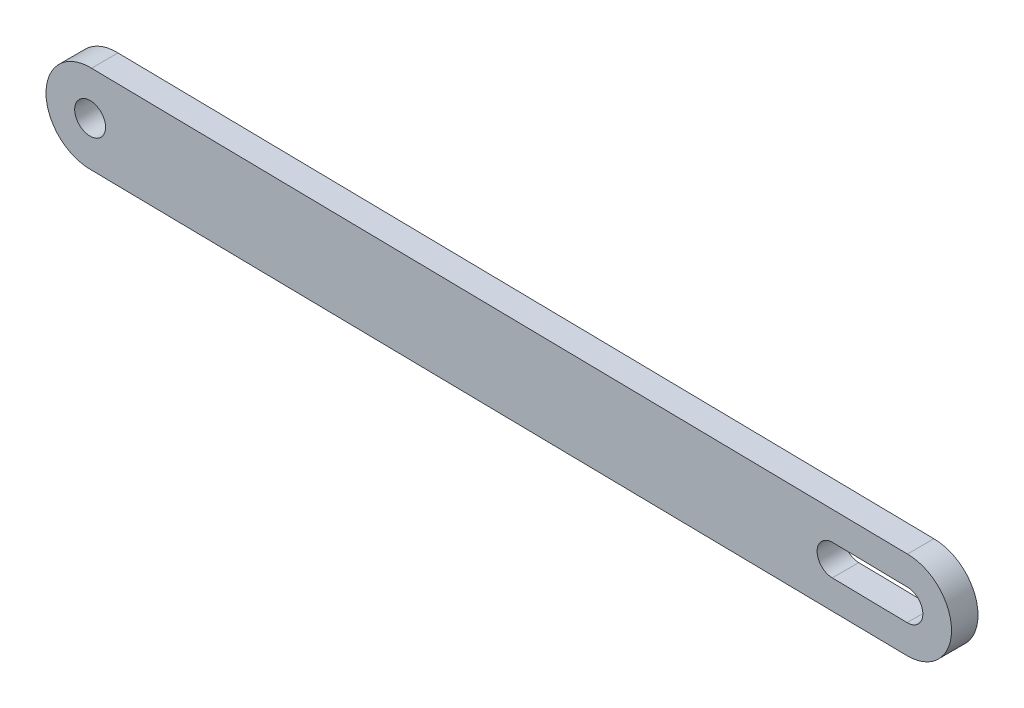
ISO-10303-21;
HEADER;
FILE_DESCRIPTION(('STEP AP214'),'2;1');
FILE_NAME('part.step','',(''),(''),'','','');
FILE_SCHEMA(('AUTOMOTIVE_DESIGN { 1 0 10303 214 1 1 1 1 }'));
ENDSEC;
DATA;
#1=APPLICATION_CONTEXT('core data for automotive mechanical design processes');
#2=APPLICATION_PROTOCOL_DEFINITION('international standard','automotive_design',2000,#1);
#3=PRODUCT_CONTEXT('',#1,'mechanical');
#4=PRODUCT('Part','Part','',(#3));
#5=PRODUCT_RELATED_PRODUCT_CATEGORY('part','',(#4));
#6=PRODUCT_DEFINITION_FORMATION('','',#4);
#7=PRODUCT_DEFINITION_CONTEXT('part definition',#1,'design');
#8=PRODUCT_DEFINITION('design','',#6,#7);
#9=PRODUCT_DEFINITION_SHAPE('','',#8);
#10=(LENGTH_UNIT() NAMED_UNIT(*) SI_UNIT(.MILLI.,.METRE.));
#11=(NAMED_UNIT(*) PLANE_ANGLE_UNIT() SI_UNIT($,.RADIAN.));
#12=(NAMED_UNIT(*) SI_UNIT($,.STERADIAN.) SOLID_ANGLE_UNIT());
#13=UNCERTAINTY_MEASURE_WITH_UNIT(LENGTH_MEASURE(1.E-05),#10,'distance_accuracy_value','');
#14=(GEOMETRIC_REPRESENTATION_CONTEXT(3) GLOBAL_UNCERTAINTY_ASSIGNED_CONTEXT((#13)) GLOBAL_UNIT_ASSIGNED_CONTEXT((#10,
#11,#12)) REPRESENTATION_CONTEXT('',''));
#15=CARTESIAN_POINT('',(0.,0.,0.));
#16=DIRECTION('',(0.,0.,1.));
#17=DIRECTION('',(1.,0.,0.));
#18=AXIS2_PLACEMENT_3D('',#15,#16,#17);
#19=CARTESIAN_POINT('',(94.85,11.0499999999998,3.));
#20=DIRECTION('',(0.,0.,1.));
#21=DIRECTION('',(1.,0.,0.));
#22=AXIS2_PLACEMENT_3D('',#19,#20,#21);
#23=PLANE('',#22);
#24=CARTESIAN_POINT('',(94.85,11.0499999999998,3.));
#25=DIRECTION('',(0.,0.,1.));
#26=DIRECTION('',(1.,0.,0.));
#27=AXIS2_PLACEMENT_3D('',#24,#25,#26);
#28=CIRCLE('',#27,5.);
#29=CARTESIAN_POINT('',(94.85,6.04999999999978,3.));
#30=VERTEX_POINT('',#29);
#31=CARTESIAN_POINT('',(94.85,16.05,3.));
#32=VERTEX_POINT('',#31);
#33=EDGE_CURVE('E9',#30,#32,#28,.T.);
#34=ORIENTED_EDGE('',*,*,#33,.T.);
#35=DIRECTION('',(-0.99987742435736,0.0156568279192049,0.));
#36=VECTOR('',#35,1.);
#37=CARTESIAN_POINT('',(94.85,16.0499999999998,3.));
#38=LINE('',#37,#36);
#39=CARTESIAN_POINT('',(2.40654908773459,17.4975486373951,3.));
#40=VERTEX_POINT('',#39);
#41=EDGE_CURVE('E25',#32,#40,#38,.T.);
#42=ORIENTED_EDGE('',*,*,#41,.T.);
#43=CARTESIAN_POINT('',(2.25,12.5,3.));
#44=DIRECTION('',(0.,0.,1.));
#45=DIRECTION('',(1.,0.,0.));
#46=AXIS2_PLACEMENT_3D('',#43,#44,#45);
#47=CIRCLE('',#46,5.);
#48=CARTESIAN_POINT('',(2.25000000000004,7.5,3.));
#49=VERTEX_POINT('',#48);
#50=EDGE_CURVE('E155',#40,#49,#47,.T.);
#51=ORIENTED_EDGE('',*,*,#50,.T.);
#52=DIRECTION('',(0.99987742435736,-0.015656827919205,0.));
#53=VECTOR('',#52,1.);
#54=CARTESIAN_POINT('',(2.25000000000004,7.49999999999999,3.));
#55=LINE('',#54,#53);
#56=EDGE_CURVE('E138',#49,#30,#55,.T.);
#57=ORIENTED_EDGE('',*,*,#56,.T.);
#58=EDGE_LOOP('',(#34,#42,#51,#57));
#59=FACE_BOUND('',#58,.T.);
#60=CARTESIAN_POINT('',(2.25,12.5,3.));
#61=DIRECTION('',(0.,0.,1.));
#62=DIRECTION('',(1.,0.,0.));
#63=AXIS2_PLACEMENT_3D('',#60,#61,#62);
#64=CIRCLE('',#63,1.75);
#65=CARTESIAN_POINT('',(4.,12.5,3.));
#66=VERTEX_POINT('',#65);
#67=EDGE_CURVE('E101',#66,#66,#64,.T.);
#68=ORIENTED_EDGE('',*,*,#67,.F.);
#69=EDGE_LOOP('',(#68));
#70=FACE_BOUND('',#69,.T.);
#71=DIRECTION('',(0.99983904662924,-0.017941037749584,0.));
#72=VECTOR('',#71,1.);
#73=CARTESIAN_POINT('',(86.3387754541496,9.45244306869901,3.));
#74=LINE('',#73,#72);
#75=CARTESIAN_POINT('',(86.3387754541496,9.45244306869901,3.));
#76=VERTEX_POINT('',#75);
#77=CARTESIAN_POINT('',(94.8186031839386,9.30028166839862,3.));
#78=VERTEX_POINT('',#77);
#79=EDGE_CURVE('E117',#76,#78,#74,.T.);
#80=ORIENTED_EDGE('',*,*,#79,.F.);
#81=CARTESIAN_POINT('',(86.3701722702114,11.2021614003002,3.));
#82=DIRECTION('',(0.,0.,1.));
#83=DIRECTION('',(1.,0.,0.));
#84=AXIS2_PLACEMENT_3D('',#81,#82,#83);
#85=CIRCLE('',#84,1.75);
#86=CARTESIAN_POINT('',(86.4015690862732,12.9518797319013,3.));
#87=VERTEX_POINT('',#86);
#88=EDGE_CURVE('E110',#87,#76,#85,.T.);
#89=ORIENTED_EDGE('',*,*,#88,.F.);
#90=DIRECTION('',(-0.99983904662924,0.0179410377495838,0.));
#91=VECTOR('',#90,1.);
#92=CARTESIAN_POINT('',(94.8813968160621,12.7997183316009,3.));
#93=LINE('',#92,#91);
#94=CARTESIAN_POINT('',(94.8813968160621,12.7997183316009,3.));
#95=VERTEX_POINT('',#94);
#96=EDGE_CURVE('E120',#95,#87,#93,.T.);
#97=ORIENTED_EDGE('',*,*,#96,.F.);
#98=CARTESIAN_POINT('',(94.85,11.0499999999998,3.));
#99=DIRECTION('',(0.,0.,1.));
#100=DIRECTION('',(1.,0.,0.));
#101=AXIS2_PLACEMENT_3D('',#98,#99,#100);
#102=CIRCLE('',#101,1.75);
#103=EDGE_CURVE('E100',#78,#95,#102,.T.);
#104=ORIENTED_EDGE('',*,*,#103,.F.);
#105=EDGE_LOOP('',(#80,#89,#97,#104));
#106=FACE_BOUND('',#105,.T.);
#107=ADVANCED_FACE('F15',(#59,#70,#106),#23,.T.);
#108=CARTESIAN_POINT('',(94.85,11.0499999999998,0.));
#109=DIRECTION('',(0.,0.,1.));
#110=DIRECTION('',(1.,0.,0.));
#111=AXIS2_PLACEMENT_3D('',#108,#109,#110);
#112=PLANE('',#111);
#113=CARTESIAN_POINT('',(94.85,11.0499999999998,0.));
#114=DIRECTION('',(0.,0.,1.));
#115=DIRECTION('',(1.,0.,0.));
#116=AXIS2_PLACEMENT_3D('',#113,#114,#115);
#117=CIRCLE('',#116,5.);
#118=CARTESIAN_POINT('',(94.85,6.04999999999978,0.));
#119=VERTEX_POINT('',#118);
#120=CARTESIAN_POINT('',(94.85,16.05,0.));
#121=VERTEX_POINT('',#120);
#122=EDGE_CURVE('E91',#119,#121,#117,.T.);
#123=ORIENTED_EDGE('',*,*,#122,.F.);
#124=DIRECTION('',(0.99987742435736,-0.015656827919205,0.));
#125=VECTOR('',#124,1.);
#126=CARTESIAN_POINT('',(2.25000000000004,7.49999999999999,0.));
#127=LINE('',#126,#125);
#128=CARTESIAN_POINT('',(2.25000000000004,7.5,0.));
#129=VERTEX_POINT('',#128);
#130=EDGE_CURVE('E125',#129,#119,#127,.T.);
#131=ORIENTED_EDGE('',*,*,#130,.F.);
#132=CARTESIAN_POINT('',(2.25,12.5,0.));
#133=DIRECTION('',(0.,0.,1.));
#134=DIRECTION('',(1.,0.,0.));
#135=AXIS2_PLACEMENT_3D('',#132,#133,#134);
#136=CIRCLE('',#135,5.);
#137=CARTESIAN_POINT('',(2.40654908773459,17.4975486373951,0.));
#138=VERTEX_POINT('',#137);
#139=EDGE_CURVE('E128',#138,#129,#136,.T.);
#140=ORIENTED_EDGE('',*,*,#139,.F.);
#141=DIRECTION('',(-0.99987742435736,0.0156568279192049,0.));
#142=VECTOR('',#141,1.);
#143=CARTESIAN_POINT('',(94.85,16.0499999999998,0.));
#144=LINE('',#143,#142);
#145=EDGE_CURVE('E132',#121,#138,#144,.T.);
#146=ORIENTED_EDGE('',*,*,#145,.F.);
#147=EDGE_LOOP('',(#123,#131,#140,#146));
#148=FACE_BOUND('',#147,.T.);
#149=CARTESIAN_POINT('',(2.25,12.5,0.));
#150=DIRECTION('',(0.,0.,1.));
#151=DIRECTION('',(1.,0.,0.));
#152=AXIS2_PLACEMENT_3D('',#149,#150,#151);
#153=CIRCLE('',#152,1.75);
#154=CARTESIAN_POINT('',(4.,12.5,0.));
#155=VERTEX_POINT('',#154);
#156=EDGE_CURVE('E135',#155,#155,#153,.T.);
#157=ORIENTED_EDGE('',*,*,#156,.T.);
#158=EDGE_LOOP('',(#157));
#159=FACE_BOUND('',#158,.T.);
#160=CARTESIAN_POINT('',(86.3701722702114,11.2021614003002,0.));
#161=DIRECTION('',(0.,0.,1.));
#162=DIRECTION('',(1.,0.,0.));
#163=AXIS2_PLACEMENT_3D('',#160,#161,#162);
#164=CIRCLE('',#163,1.75);
#165=CARTESIAN_POINT('',(86.4015690862732,12.9518797319013,0.));
#166=VERTEX_POINT('',#165);
#167=CARTESIAN_POINT('',(86.3387754541496,9.45244306869901,0.));
#168=VERTEX_POINT('',#167);
#169=EDGE_CURVE('E139',#166,#168,#164,.T.);
#170=ORIENTED_EDGE('',*,*,#169,.T.);
#171=DIRECTION('',(0.99983904662924,-0.017941037749584,0.));
#172=VECTOR('',#171,1.);
#173=CARTESIAN_POINT('',(86.3387754541496,9.45244306869901,0.));
#174=LINE('',#173,#172);
#175=CARTESIAN_POINT('',(94.8186031839386,9.30028166839862,0.));
#176=VERTEX_POINT('',#175);
#177=EDGE_CURVE('E94',#168,#176,#174,.T.);
#178=ORIENTED_EDGE('',*,*,#177,.T.);
#179=CARTESIAN_POINT('',(94.85,11.0499999999998,0.));
#180=DIRECTION('',(0.,0.,1.));
#181=DIRECTION('',(1.,0.,0.));
#182=AXIS2_PLACEMENT_3D('',#179,#180,#181);
#183=CIRCLE('',#182,1.75);
#184=CARTESIAN_POINT('',(94.8813968160622,12.7997183316009,0.));
#185=VERTEX_POINT('',#184);
#186=EDGE_CURVE('E77',#176,#185,#183,.T.);
#187=ORIENTED_EDGE('',*,*,#186,.T.);
#188=DIRECTION('',(-0.99983904662924,0.0179410377495839,0.));
#189=VECTOR('',#188,1.);
#190=CARTESIAN_POINT('',(94.8813968160622,12.7997183316009,0.));
#191=LINE('',#190,#189);
#192=EDGE_CURVE('E83',#185,#166,#191,.T.);
#193=ORIENTED_EDGE('',*,*,#192,.T.);
#194=EDGE_LOOP('',(#170,#178,#187,#193));
#195=FACE_BOUND('',#194,.T.);
#196=ADVANCED_FACE('F93',(#148,#159,#195),#112,.F.);
#197=CARTESIAN_POINT('',(94.85,11.0499999999998,3.));
#198=DIRECTION('',(0.,0.,-1.));
#199=DIRECTION('',(0.,-1.,0.));
#200=AXIS2_PLACEMENT_3D('',#197,#198,#199);
#201=CYLINDRICAL_SURFACE('',#200,5.);
#202=ORIENTED_EDGE('',*,*,#122,.T.);
#203=DIRECTION('',(0.,0.,-1.));
#204=VECTOR('',#203,1.);
#205=CARTESIAN_POINT('',(94.85,16.05,3.));
#206=LINE('',#205,#204);
#207=EDGE_CURVE('E131',#32,#121,#206,.T.);
#208=ORIENTED_EDGE('',*,*,#207,.F.);
#209=ORIENTED_EDGE('',*,*,#33,.F.);
#210=DIRECTION('',(0.,0.,-1.));
#211=VECTOR('',#210,1.);
#212=CARTESIAN_POINT('',(94.85,6.04999999999978,3.));
#213=LINE('',#212,#211);
#214=EDGE_CURVE('E124',#30,#119,#213,.T.);
#215=ORIENTED_EDGE('',*,*,#214,.T.);
#216=EDGE_LOOP('',(#202,#208,#209,#215));
#217=FACE_BOUND('',#216,.T.);
#218=ADVANCED_FACE('F162',(#217),#201,.T.);
#219=CARTESIAN_POINT('',(2.40654908773459,17.4975486373951,3.));
#220=DIRECTION('',(-0.015656827919205,-0.99987742435736,0.));
#221=DIRECTION('',(0.99987742435736,-0.015656827919205,0.));
#222=AXIS2_PLACEMENT_3D('',#219,#220,#221);
#223=PLANE('',#222);
#224=ORIENTED_EDGE('',*,*,#145,.T.);
#225=DIRECTION('',(0.,0.,-1.));
#226=VECTOR('',#225,1.);
#227=CARTESIAN_POINT('',(2.40654908773459,17.4975486373951,3.));
#228=LINE('',#227,#226);
#229=EDGE_CURVE('E127',#40,#138,#228,.T.);
#230=ORIENTED_EDGE('',*,*,#229,.F.);
#231=ORIENTED_EDGE('',*,*,#41,.F.);
#232=ORIENTED_EDGE('',*,*,#207,.T.);
#233=EDGE_LOOP('',(#224,#230,#231,#232));
#234=FACE_BOUND('',#233,.T.);
#235=ADVANCED_FACE('F158',(#234),#223,.F.);
#236=CARTESIAN_POINT('',(2.25,12.5,3.));
#237=DIRECTION('',(0.,0.,-1.));
#238=DIRECTION('',(0.,-1.,0.));
#239=AXIS2_PLACEMENT_3D('',#236,#237,#238);
#240=CYLINDRICAL_SURFACE('',#239,5.);
#241=ORIENTED_EDGE('',*,*,#139,.T.);
#242=DIRECTION('',(0.,0.,-1.));
#243=VECTOR('',#242,1.);
#244=CARTESIAN_POINT('',(2.25000000000004,7.5,3.));
#245=LINE('',#244,#243);
#246=EDGE_CURVE('E103',#49,#129,#245,.T.);
#247=ORIENTED_EDGE('',*,*,#246,.F.);
#248=ORIENTED_EDGE('',*,*,#50,.F.);
#249=ORIENTED_EDGE('',*,*,#229,.T.);
#250=EDGE_LOOP('',(#241,#247,#248,#249));
#251=FACE_BOUND('',#250,.T.);
#252=ADVANCED_FACE('F17',(#251),#240,.T.);
#253=CARTESIAN_POINT('',(94.85,6.04999999999978,3.));
#254=DIRECTION('',(0.015656827919205,0.99987742435736,0.));
#255=DIRECTION('',(-0.99987742435736,0.015656827919205,0.));
#256=AXIS2_PLACEMENT_3D('',#253,#254,#255);
#257=PLANE('',#256);
#258=ORIENTED_EDGE('',*,*,#130,.T.);
#259=ORIENTED_EDGE('',*,*,#214,.F.);
#260=ORIENTED_EDGE('',*,*,#56,.F.);
#261=ORIENTED_EDGE('',*,*,#246,.T.);
#262=EDGE_LOOP('',(#258,#259,#260,#261));
#263=FACE_BOUND('',#262,.T.);
#264=ADVANCED_FACE('F149',(#263),#257,.F.);
#265=CARTESIAN_POINT('',(94.85,11.0499999999998,3.));
#266=DIRECTION('',(0.,0.,-1.));
#267=DIRECTION('',(0.,-1.,0.));
#268=AXIS2_PLACEMENT_3D('',#265,#266,#267);
#269=CYLINDRICAL_SURFACE('',#268,1.75);
#270=DIRECTION('',(0.,0.,-1.));
#271=VECTOR('',#270,1.);
#272=CARTESIAN_POINT('',(94.8186031839386,9.30028166839862,3.));
#273=LINE('',#272,#271);
#274=EDGE_CURVE('E108',#78,#176,#273,.T.);
#275=ORIENTED_EDGE('',*,*,#274,.F.);
#276=ORIENTED_EDGE('',*,*,#103,.T.);
#277=DIRECTION('',(0.,0.,-1.));
#278=VECTOR('',#277,1.);
#279=CARTESIAN_POINT('',(94.8813968160622,12.7997183316009,3.));
#280=LINE('',#279,#278);
#281=EDGE_CURVE('E85',#95,#185,#280,.T.);
#282=ORIENTED_EDGE('',*,*,#281,.T.);
#283=ORIENTED_EDGE('',*,*,#186,.F.);
#284=EDGE_LOOP('',(#275,#276,#282,#283));
#285=FACE_BOUND('',#284,.T.);
#286=ADVANCED_FACE('F98',(#285),#269,.F.);
#287=CARTESIAN_POINT('',(2.25,12.5,3.));
#288=DIRECTION('',(0.,0.,-1.));
#289=DIRECTION('',(0.,-1.,0.));
#290=AXIS2_PLACEMENT_3D('',#287,#288,#289);
#291=CYLINDRICAL_SURFACE('',#290,1.75);
#292=ORIENTED_EDGE('',*,*,#67,.T.);
#293=EDGE_LOOP('',(#292));
#294=FACE_BOUND('',#293,.T.);
#295=ORIENTED_EDGE('',*,*,#156,.F.);
#296=EDGE_LOOP('',(#295));
#297=FACE_BOUND('',#296,.T.);
#298=ADVANCED_FACE('F176',(#294,#297),#291,.F.);
#299=CARTESIAN_POINT('',(86.3701722702114,11.2021614003002,-7.));
#300=DIRECTION('',(0.,0.,1.));
#301=DIRECTION('',(1.,0.,0.));
#302=AXIS2_PLACEMENT_3D('',#299,#300,#301);
#303=CYLINDRICAL_SURFACE('',#302,1.75);
#304=DIRECTION('',(0.,0.,1.));
#305=VECTOR('',#304,1.);
#306=CARTESIAN_POINT('',(86.4015690862732,12.9518797319013,0.));
#307=LINE('',#306,#305);
#308=EDGE_CURVE('E87',#166,#87,#307,.T.);
#309=ORIENTED_EDGE('',*,*,#308,.T.);
#310=ORIENTED_EDGE('',*,*,#88,.T.);
#311=DIRECTION('',(0.,0.,1.));
#312=VECTOR('',#311,1.);
#313=CARTESIAN_POINT('',(86.3387754541496,9.45244306869901,0.));
#314=LINE('',#313,#312);
#315=EDGE_CURVE('E19',#168,#76,#314,.T.);
#316=ORIENTED_EDGE('',*,*,#315,.F.);
#317=ORIENTED_EDGE('',*,*,#169,.F.);
#318=EDGE_LOOP('',(#309,#310,#316,#317));
#319=FACE_BOUND('',#318,.T.);
#320=ADVANCED_FACE('F174',(#319),#303,.F.);
#321=CARTESIAN_POINT('',(94.8186031839386,9.30028166839862,-7.));
#322=DIRECTION('',(-0.017941037749584,-0.99983904662924,0.));
#323=DIRECTION('',(0.99983904662924,-0.017941037749584,0.));
#324=AXIS2_PLACEMENT_3D('',#321,#322,#323);
#325=PLANE('',#324);
#326=ORIENTED_EDGE('',*,*,#315,.T.);
#327=ORIENTED_EDGE('',*,*,#79,.T.);
#328=ORIENTED_EDGE('',*,*,#274,.T.);
#329=ORIENTED_EDGE('',*,*,#177,.F.);
#330=EDGE_LOOP('',(#326,#327,#328,#329));
#331=FACE_BOUND('',#330,.T.);
#332=ADVANCED_FACE('F173',(#331),#325,.F.);
#333=CARTESIAN_POINT('',(94.8813968160621,12.7997183316009,-7.));
#334=DIRECTION('',(0.017941037749584,0.99983904662924,0.));
#335=DIRECTION('',(-0.99983904662924,0.017941037749584,0.));
#336=AXIS2_PLACEMENT_3D('',#333,#334,#335);
#337=PLANE('',#336);
#338=ORIENTED_EDGE('',*,*,#281,.F.);
#339=ORIENTED_EDGE('',*,*,#96,.T.);
#340=ORIENTED_EDGE('',*,*,#308,.F.);
#341=ORIENTED_EDGE('',*,*,#192,.F.);
#342=EDGE_LOOP('',(#338,#339,#340,#341));
#343=FACE_BOUND('',#342,.T.);
#344=ADVANCED_FACE('F84',(#343),#337,.F.);
#345=CLOSED_SHELL('',(#107,#196,#218,#235,#252,#264,#286,#298,#320,#332,#344));
#346=MANIFOLD_SOLID_BREP('B1',#345);
#347=ADVANCED_BREP_SHAPE_REPRESENTATION('',(#18,#346),#14);
#348=SHAPE_DEFINITION_REPRESENTATION(#9,#347);
ENDSEC;
END-ISO-10303-21;
